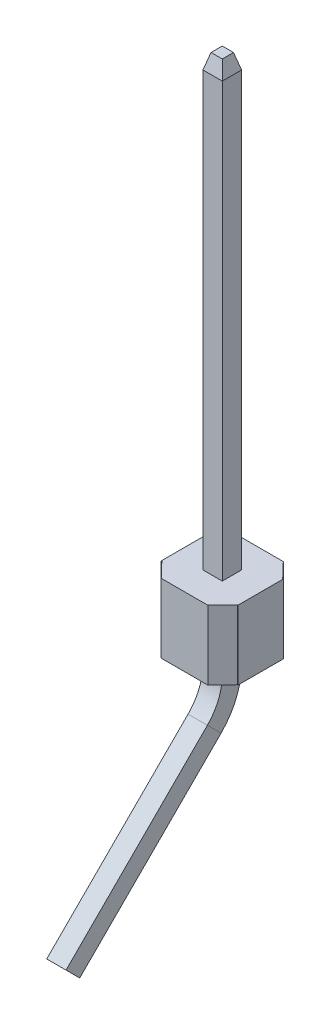
ISO-10303-21;
HEADER;
FILE_DESCRIPTION(('STEP AP214'),'2;1');
FILE_NAME('part.step','',(''),(''),'','','');
FILE_SCHEMA(('AUTOMOTIVE_DESIGN { 1 0 10303 214 1 1 1 1 }'));
ENDSEC;
DATA;
#1=APPLICATION_CONTEXT('core data for automotive mechanical design processes');
#2=APPLICATION_PROTOCOL_DEFINITION('international standard','automotive_design',2000,#1);
#3=PRODUCT_CONTEXT('',#1,'mechanical');
#4=PRODUCT('Part','Part','',(#3));
#5=PRODUCT_RELATED_PRODUCT_CATEGORY('part','',(#4));
#6=PRODUCT_DEFINITION_FORMATION('','',#4);
#7=PRODUCT_DEFINITION_CONTEXT('part definition',#1,'design');
#8=PRODUCT_DEFINITION('design','',#6,#7);
#9=PRODUCT_DEFINITION_SHAPE('','',#8);
#10=(LENGTH_UNIT() NAMED_UNIT(*) SI_UNIT(.MILLI.,.METRE.));
#11=(NAMED_UNIT(*) PLANE_ANGLE_UNIT() SI_UNIT($,.RADIAN.));
#12=(NAMED_UNIT(*) SI_UNIT($,.STERADIAN.) SOLID_ANGLE_UNIT());
#13=UNCERTAINTY_MEASURE_WITH_UNIT(LENGTH_MEASURE(1.E-05),#10,'distance_accuracy_value','');
#14=(GEOMETRIC_REPRESENTATION_CONTEXT(3) GLOBAL_UNCERTAINTY_ASSIGNED_CONTEXT((#13)) GLOBAL_UNIT_ASSIGNED_CONTEXT((#10,
#11,#12)) REPRESENTATION_CONTEXT('',''));
#15=CARTESIAN_POINT('',(0.,0.,0.));
#16=DIRECTION('',(0.,0.,1.));
#17=DIRECTION('',(1.,0.,0.));
#18=AXIS2_PLACEMENT_3D('',#15,#16,#17);
#19=CARTESIAN_POINT('',(0.,2.29,0.));
#20=DIRECTION('',(0.,-1.,0.));
#21=DIRECTION('',(0.,0.,-1.));
#22=AXIS2_PLACEMENT_3D('',#19,#20,#21);
#23=PLANE('',#22);
#24=DIRECTION('',(-0.692531828189713,0.,0.721387321030952));
#25=VECTOR('',#24,1.);
#26=CARTESIAN_POINT('',(-0.770000000000001,2.29,-1.25));
#27=LINE('',#26,#25);
#28=CARTESIAN_POINT('',(-0.770000000000001,2.29,-1.25));
#29=VERTEX_POINT('',#28);
#30=CARTESIAN_POINT('',(-1.25,2.29,-0.749999999999999));
#31=VERTEX_POINT('',#30);
#32=EDGE_CURVE('E350',#29,#31,#27,.T.);
#33=ORIENTED_EDGE('',*,*,#32,.T.);
#34=DIRECTION('',(-1.,0.,0.));
#35=VECTOR('',#34,1.);
#36=CARTESIAN_POINT('',(-1.25,2.29,-0.749999999999999));
#37=LINE('',#36,#35);
#38=CARTESIAN_POINT('',(-1.27,2.29,-0.749999999999999));
#39=VERTEX_POINT('',#38);
#40=EDGE_CURVE('E354',#31,#39,#37,.T.);
#41=ORIENTED_EDGE('',*,*,#40,.T.);
#42=DIRECTION('',(0.,0.,1.));
#43=VECTOR('',#42,1.);
#44=CARTESIAN_POINT('',(-1.27,2.29,0.75));
#45=LINE('',#44,#43);
#46=CARTESIAN_POINT('',(-1.27,2.29,0.75));
#47=VERTEX_POINT('',#46);
#48=EDGE_CURVE('E358',#39,#47,#45,.T.);
#49=ORIENTED_EDGE('',*,*,#48,.T.);
#50=DIRECTION('',(1.,0.,0.));
#51=VECTOR('',#50,1.);
#52=CARTESIAN_POINT('',(-1.25,2.29,0.75));
#53=LINE('',#52,#51);
#54=CARTESIAN_POINT('',(-1.25,2.29,0.75));
#55=VERTEX_POINT('',#54);
#56=EDGE_CURVE('E361',#47,#55,#53,.T.);
#57=ORIENTED_EDGE('',*,*,#56,.T.);
#58=DIRECTION('',(0.692531828189713,0.,0.721387321030951));
#59=VECTOR('',#58,1.);
#60=CARTESIAN_POINT('',(-0.77,2.29,1.25));
#61=LINE('',#60,#59);
#62=CARTESIAN_POINT('',(-0.77,2.29,1.25));
#63=VERTEX_POINT('',#62);
#64=EDGE_CURVE('E364',#55,#63,#61,.T.);
#65=ORIENTED_EDGE('',*,*,#64,.T.);
#66=DIRECTION('',(1.,0.,0.));
#67=VECTOR('',#66,1.);
#68=CARTESIAN_POINT('',(-0.77,2.29,1.25));
#69=LINE('',#68,#67);
#70=CARTESIAN_POINT('',(0.77,2.29,1.25));
#71=VERTEX_POINT('',#70);
#72=EDGE_CURVE('E367',#63,#71,#69,.T.);
#73=ORIENTED_EDGE('',*,*,#72,.T.);
#74=DIRECTION('',(0.692531828189713,0.,-0.721387321030952));
#75=VECTOR('',#74,1.);
#76=CARTESIAN_POINT('',(0.77,2.29,1.25));
#77=LINE('',#76,#75);
#78=CARTESIAN_POINT('',(1.25,2.29,0.749999999999999));
#79=VERTEX_POINT('',#78);
#80=EDGE_CURVE('E370',#71,#79,#77,.T.);
#81=ORIENTED_EDGE('',*,*,#80,.T.);
#82=DIRECTION('',(1.,0.,0.));
#83=VECTOR('',#82,1.);
#84=CARTESIAN_POINT('',(1.25,2.29,0.749999999999999));
#85=LINE('',#84,#83);
#86=CARTESIAN_POINT('',(1.27,2.29,0.749999999999999));
#87=VERTEX_POINT('',#86);
#88=EDGE_CURVE('E373',#79,#87,#85,.T.);
#89=ORIENTED_EDGE('',*,*,#88,.T.);
#90=DIRECTION('',(0.,0.,-1.));
#91=VECTOR('',#90,1.);
#92=CARTESIAN_POINT('',(1.27,2.29,0.749999999999999));
#93=LINE('',#92,#91);
#94=CARTESIAN_POINT('',(1.27,2.29,-0.749999999999999));
#95=VERTEX_POINT('',#94);
#96=EDGE_CURVE('E376',#87,#95,#93,.T.);
#97=ORIENTED_EDGE('',*,*,#96,.T.);
#98=DIRECTION('',(-1.,0.,0.));
#99=VECTOR('',#98,1.);
#100=CARTESIAN_POINT('',(1.25,2.29,-0.749999999999999));
#101=LINE('',#100,#99);
#102=CARTESIAN_POINT('',(1.25,2.29,-0.749999999999999));
#103=VERTEX_POINT('',#102);
#104=EDGE_CURVE('E379',#95,#103,#101,.T.);
#105=ORIENTED_EDGE('',*,*,#104,.T.);
#106=DIRECTION('',(-0.692531828189713,0.,-0.721387321030952));
#107=VECTOR('',#106,1.);
#108=CARTESIAN_POINT('',(0.77,2.29,-1.25));
#109=LINE('',#108,#107);
#110=CARTESIAN_POINT('',(0.77,2.29,-1.25));
#111=VERTEX_POINT('',#110);
#112=EDGE_CURVE('E382',#103,#111,#109,.T.);
#113=ORIENTED_EDGE('',*,*,#112,.T.);
#114=DIRECTION('',(-1.,0.,0.));
#115=VECTOR('',#114,1.);
#116=CARTESIAN_POINT('',(-0.770000000000001,2.29,-1.25));
#117=LINE('',#116,#115);
#118=EDGE_CURVE('E385',#111,#29,#117,.T.);
#119=ORIENTED_EDGE('',*,*,#118,.T.);
#120=EDGE_LOOP('',(#33,#41,#49,#57,#65,#73,#81,#89,#97,#105,#113,#119));
#121=FACE_BOUND('',#120,.T.);
#122=DIRECTION('',(0.,0.,1.));
#123=VECTOR('',#122,1.);
#124=CARTESIAN_POINT('',(-0.32,2.29,0.));
#125=LINE('',#124,#123);
#126=CARTESIAN_POINT('',(-0.32,2.29,-0.320000000000002));
#127=VERTEX_POINT('',#126);
#128=CARTESIAN_POINT('',(-0.32,2.29,0.319999999999998));
#129=VERTEX_POINT('',#128);
#130=EDGE_CURVE('E345',#127,#129,#125,.T.);
#131=ORIENTED_EDGE('',*,*,#130,.F.);
#132=DIRECTION('',(-1.,0.,0.));
#133=VECTOR('',#132,1.);
#134=CARTESIAN_POINT('',(0.,2.29,-0.320000000000002));
#135=LINE('',#134,#133);
#136=CARTESIAN_POINT('',(0.32,2.29,-0.320000000000002));
#137=VERTEX_POINT('',#136);
#138=EDGE_CURVE('E333',#137,#127,#135,.T.);
#139=ORIENTED_EDGE('',*,*,#138,.F.);
#140=DIRECTION('',(0.,0.,-1.));
#141=VECTOR('',#140,1.);
#142=CARTESIAN_POINT('',(0.32,2.29,0.));
#143=LINE('',#142,#141);
#144=CARTESIAN_POINT('',(0.32,2.29,0.32));
#145=VERTEX_POINT('',#144);
#146=EDGE_CURVE('E337',#145,#137,#143,.T.);
#147=ORIENTED_EDGE('',*,*,#146,.F.);
#148=DIRECTION('',(1.,0.,0.));
#149=VECTOR('',#148,1.);
#150=CARTESIAN_POINT('',(0.,2.29,0.319999999999998));
#151=LINE('',#150,#149);
#152=EDGE_CURVE('E341',#129,#145,#151,.T.);
#153=ORIENTED_EDGE('',*,*,#152,.F.);
#154=EDGE_LOOP('',(#131,#139,#147,#153));
#155=FACE_BOUND('',#154,.T.);
#156=ADVANCED_FACE('F43',(#121,#155),#23,.F.);
#157=CARTESIAN_POINT('',(0.,0.,0.));
#158=DIRECTION('',(0.,-1.,0.));
#159=DIRECTION('',(0.,0.,-1.));
#160=AXIS2_PLACEMENT_3D('',#157,#158,#159);
#161=PLANE('',#160);
#162=DIRECTION('',(-0.692531828189713,0.,0.721387321030952));
#163=VECTOR('',#162,1.);
#164=CARTESIAN_POINT('',(-0.770000000000001,0.,-1.25));
#165=LINE('',#164,#163);
#166=CARTESIAN_POINT('',(-0.770000000000001,0.,-1.25));
#167=VERTEX_POINT('',#166);
#168=CARTESIAN_POINT('',(-1.25,0.,-0.749999999999999));
#169=VERTEX_POINT('',#168);
#170=EDGE_CURVE('E349',#167,#169,#165,.T.);
#171=ORIENTED_EDGE('',*,*,#170,.F.);
#172=DIRECTION('',(-1.,0.,0.));
#173=VECTOR('',#172,1.);
#174=CARTESIAN_POINT('',(-0.770000000000001,0.,-1.25));
#175=LINE('',#174,#173);
#176=CARTESIAN_POINT('',(0.77,0.,-1.25));
#177=VERTEX_POINT('',#176);
#178=EDGE_CURVE('E355',#177,#167,#175,.T.);
#179=ORIENTED_EDGE('',*,*,#178,.F.);
#180=DIRECTION('',(-0.692531828189713,0.,-0.721387321030952));
#181=VECTOR('',#180,1.);
#182=CARTESIAN_POINT('',(0.77,0.,-1.25));
#183=LINE('',#182,#181);
#184=CARTESIAN_POINT('',(1.25,0.,-0.749999999999999));
#185=VERTEX_POINT('',#184);
#186=EDGE_CURVE('E419',#185,#177,#183,.T.);
#187=ORIENTED_EDGE('',*,*,#186,.F.);
#188=DIRECTION('',(-1.,0.,0.));
#189=VECTOR('',#188,1.);
#190=CARTESIAN_POINT('',(1.25,0.,-0.749999999999999));
#191=LINE('',#190,#189);
#192=CARTESIAN_POINT('',(1.27,0.,-0.749999999999999));
#193=VERTEX_POINT('',#192);
#194=EDGE_CURVE('E416',#193,#185,#191,.T.);
#195=ORIENTED_EDGE('',*,*,#194,.F.);
#196=DIRECTION('',(0.,0.,-1.));
#197=VECTOR('',#196,1.);
#198=CARTESIAN_POINT('',(1.27,0.,0.749999999999999));
#199=LINE('',#198,#197);
#200=CARTESIAN_POINT('',(1.27,0.,0.749999999999999));
#201=VERTEX_POINT('',#200);
#202=EDGE_CURVE('E413',#201,#193,#199,.T.);
#203=ORIENTED_EDGE('',*,*,#202,.F.);
#204=DIRECTION('',(1.,0.,0.));
#205=VECTOR('',#204,1.);
#206=CARTESIAN_POINT('',(1.25,0.,0.749999999999999));
#207=LINE('',#206,#205);
#208=CARTESIAN_POINT('',(1.25,0.,0.749999999999999));
#209=VERTEX_POINT('',#208);
#210=EDGE_CURVE('E410',#209,#201,#207,.T.);
#211=ORIENTED_EDGE('',*,*,#210,.F.);
#212=DIRECTION('',(0.692531828189713,0.,-0.721387321030952));
#213=VECTOR('',#212,1.);
#214=CARTESIAN_POINT('',(0.77,0.,1.25));
#215=LINE('',#214,#213);
#216=CARTESIAN_POINT('',(0.77,0.,1.25));
#217=VERTEX_POINT('',#216);
#218=EDGE_CURVE('E407',#217,#209,#215,.T.);
#219=ORIENTED_EDGE('',*,*,#218,.F.);
#220=DIRECTION('',(1.,0.,0.));
#221=VECTOR('',#220,1.);
#222=CARTESIAN_POINT('',(-0.77,0.,1.25));
#223=LINE('',#222,#221);
#224=CARTESIAN_POINT('',(-0.77,0.,1.25));
#225=VERTEX_POINT('',#224);
#226=EDGE_CURVE('E404',#225,#217,#223,.T.);
#227=ORIENTED_EDGE('',*,*,#226,.F.);
#228=DIRECTION('',(0.692531828189713,0.,0.721387321030951));
#229=VECTOR('',#228,1.);
#230=CARTESIAN_POINT('',(-0.77,0.,1.25));
#231=LINE('',#230,#229);
#232=CARTESIAN_POINT('',(-1.25,0.,0.75));
#233=VERTEX_POINT('',#232);
#234=EDGE_CURVE('E401',#233,#225,#231,.T.);
#235=ORIENTED_EDGE('',*,*,#234,.F.);
#236=DIRECTION('',(1.,0.,0.));
#237=VECTOR('',#236,1.);
#238=CARTESIAN_POINT('',(-1.25,0.,0.75));
#239=LINE('',#238,#237);
#240=CARTESIAN_POINT('',(-1.27,0.,0.75));
#241=VERTEX_POINT('',#240);
#242=EDGE_CURVE('E398',#241,#233,#239,.T.);
#243=ORIENTED_EDGE('',*,*,#242,.F.);
#244=DIRECTION('',(0.,0.,1.));
#245=VECTOR('',#244,1.);
#246=CARTESIAN_POINT('',(-1.27,0.,0.75));
#247=LINE('',#246,#245);
#248=CARTESIAN_POINT('',(-1.27,0.,-0.749999999999999));
#249=VERTEX_POINT('',#248);
#250=EDGE_CURVE('E395',#249,#241,#247,.T.);
#251=ORIENTED_EDGE('',*,*,#250,.F.);
#252=DIRECTION('',(-1.,0.,0.));
#253=VECTOR('',#252,1.);
#254=CARTESIAN_POINT('',(-1.25,0.,-0.749999999999999));
#255=LINE('',#254,#253);
#256=EDGE_CURVE('E392',#169,#249,#255,.T.);
#257=ORIENTED_EDGE('',*,*,#256,.F.);
#258=EDGE_LOOP('',(#171,#179,#187,#195,#203,#211,#219,#227,#235,#243,#251,#257));
#259=FACE_BOUND('',#258,.T.);
#260=DIRECTION('',(-1.,0.,0.));
#261=VECTOR('',#260,1.);
#262=CARTESIAN_POINT('',(0.,0.,-0.320000000000002));
#263=LINE('',#262,#261);
#264=CARTESIAN_POINT('',(0.32,0.,-0.320000000000002));
#265=VERTEX_POINT('',#264);
#266=CARTESIAN_POINT('',(-0.32,0.,-0.320000000000002));
#267=VERTEX_POINT('',#266);
#268=EDGE_CURVE('E471',#265,#267,#263,.T.);
#269=ORIENTED_EDGE('',*,*,#268,.T.);
#270=DIRECTION('',(0.,0.,1.));
#271=VECTOR('',#270,1.);
#272=CARTESIAN_POINT('',(-0.32,0.,0.));
#273=LINE('',#272,#271);
#274=CARTESIAN_POINT('',(-0.32,0.,0.319999999999998));
#275=VERTEX_POINT('',#274);
#276=EDGE_CURVE('E226',#267,#275,#273,.T.);
#277=ORIENTED_EDGE('',*,*,#276,.T.);
#278=DIRECTION('',(1.,0.,0.));
#279=VECTOR('',#278,1.);
#280=CARTESIAN_POINT('',(0.,0.,0.319999999999998));
#281=LINE('',#280,#279);
#282=CARTESIAN_POINT('',(0.32,0.,0.319999999999998));
#283=VERTEX_POINT('',#282);
#284=EDGE_CURVE('E478',#275,#283,#281,.T.);
#285=ORIENTED_EDGE('',*,*,#284,.T.);
#286=DIRECTION('',(0.,0.,-1.));
#287=VECTOR('',#286,1.);
#288=CARTESIAN_POINT('',(0.32,0.,0.));
#289=LINE('',#288,#287);
#290=EDGE_CURVE('E474',#283,#265,#289,.T.);
#291=ORIENTED_EDGE('',*,*,#290,.T.);
#292=EDGE_LOOP('',(#269,#277,#285,#291));
#293=FACE_BOUND('',#292,.T.);
#294=ADVANCED_FACE('F552',(#259,#293),#161,.T.);
#295=CARTESIAN_POINT('',(-0.770000000000001,2.29,-1.25));
#296=DIRECTION('',(0.721387321030952,0.,0.692531828189713));
#297=DIRECTION('',(0.692531828189713,0.,-0.721387321030952));
#298=AXIS2_PLACEMENT_3D('',#295,#296,#297);
#299=PLANE('',#298);
#300=ORIENTED_EDGE('',*,*,#170,.T.);
#301=DIRECTION('',(0.,-1.,0.));
#302=VECTOR('',#301,1.);
#303=CARTESIAN_POINT('',(-1.25,2.29,-0.749999999999999));
#304=LINE('',#303,#302);
#305=EDGE_CURVE('E467',#31,#169,#304,.T.);
#306=ORIENTED_EDGE('',*,*,#305,.F.);
#307=ORIENTED_EDGE('',*,*,#32,.F.);
#308=DIRECTION('',(0.,-1.,0.));
#309=VECTOR('',#308,1.);
#310=CARTESIAN_POINT('',(-0.770000000000001,2.29,-1.25));
#311=LINE('',#310,#309);
#312=EDGE_CURVE('E388',#29,#167,#311,.T.);
#313=ORIENTED_EDGE('',*,*,#312,.T.);
#314=EDGE_LOOP('',(#300,#306,#307,#313));
#315=FACE_BOUND('',#314,.T.);
#316=ADVANCED_FACE('F557',(#315),#299,.F.);
#317=CARTESIAN_POINT('',(-1.25,2.29,-0.749999999999999));
#318=DIRECTION('',(0.,0.,1.));
#319=DIRECTION('',(1.,0.,0.));
#320=AXIS2_PLACEMENT_3D('',#317,#318,#319);
#321=PLANE('',#320);
#322=ORIENTED_EDGE('',*,*,#256,.T.);
#323=DIRECTION('',(0.,-1.,0.));
#324=VECTOR('',#323,1.);
#325=CARTESIAN_POINT('',(-1.27,2.29,-0.749999999999999));
#326=LINE('',#325,#324);
#327=EDGE_CURVE('E463',#39,#249,#326,.T.);
#328=ORIENTED_EDGE('',*,*,#327,.F.);
#329=ORIENTED_EDGE('',*,*,#40,.F.);
#330=ORIENTED_EDGE('',*,*,#305,.T.);
#331=EDGE_LOOP('',(#322,#328,#329,#330));
#332=FACE_BOUND('',#331,.T.);
#333=ADVANCED_FACE('F602',(#332),#321,.F.);
#334=CARTESIAN_POINT('',(-1.27,2.29,0.75));
#335=DIRECTION('',(1.,0.,0.));
#336=DIRECTION('',(0.,0.,-1.));
#337=AXIS2_PLACEMENT_3D('',#334,#335,#336);
#338=PLANE('',#337);
#339=ORIENTED_EDGE('',*,*,#250,.T.);
#340=DIRECTION('',(0.,-1.,0.));
#341=VECTOR('',#340,1.);
#342=CARTESIAN_POINT('',(-1.27,2.29,0.75));
#343=LINE('',#342,#341);
#344=EDGE_CURVE('E459',#47,#241,#343,.T.);
#345=ORIENTED_EDGE('',*,*,#344,.F.);
#346=ORIENTED_EDGE('',*,*,#48,.F.);
#347=ORIENTED_EDGE('',*,*,#327,.T.);
#348=EDGE_LOOP('',(#339,#345,#346,#347));
#349=FACE_BOUND('',#348,.T.);
#350=ADVANCED_FACE('F598',(#349),#338,.F.);
#351=CARTESIAN_POINT('',(-1.25,2.29,0.75));
#352=DIRECTION('',(0.,0.,-1.));
#353=DIRECTION('',(-1.,0.,0.));
#354=AXIS2_PLACEMENT_3D('',#351,#352,#353);
#355=PLANE('',#354);
#356=ORIENTED_EDGE('',*,*,#242,.T.);
#357=DIRECTION('',(0.,-1.,0.));
#358=VECTOR('',#357,1.);
#359=CARTESIAN_POINT('',(-1.25,2.29,0.75));
#360=LINE('',#359,#358);
#361=EDGE_CURVE('E455',#55,#233,#360,.T.);
#362=ORIENTED_EDGE('',*,*,#361,.F.);
#363=ORIENTED_EDGE('',*,*,#56,.F.);
#364=ORIENTED_EDGE('',*,*,#344,.T.);
#365=EDGE_LOOP('',(#356,#362,#363,#364));
#366=FACE_BOUND('',#365,.T.);
#367=ADVANCED_FACE('F594',(#366),#355,.F.);
#368=CARTESIAN_POINT('',(-0.77,2.29,1.25));
#369=DIRECTION('',(0.721387321030951,0.,-0.692531828189714));
#370=DIRECTION('',(-0.692531828189714,0.,-0.721387321030951));
#371=AXIS2_PLACEMENT_3D('',#368,#369,#370);
#372=PLANE('',#371);
#373=ORIENTED_EDGE('',*,*,#234,.T.);
#374=DIRECTION('',(0.,-1.,0.));
#375=VECTOR('',#374,1.);
#376=CARTESIAN_POINT('',(-0.77,2.29,1.25));
#377=LINE('',#376,#375);
#378=EDGE_CURVE('E451',#63,#225,#377,.T.);
#379=ORIENTED_EDGE('',*,*,#378,.F.);
#380=ORIENTED_EDGE('',*,*,#64,.F.);
#381=ORIENTED_EDGE('',*,*,#361,.T.);
#382=EDGE_LOOP('',(#373,#379,#380,#381));
#383=FACE_BOUND('',#382,.T.);
#384=ADVANCED_FACE('F590',(#383),#372,.F.);
#385=CARTESIAN_POINT('',(-0.77,2.29,1.25));
#386=DIRECTION('',(0.,0.,-1.));
#387=DIRECTION('',(-1.,0.,0.));
#388=AXIS2_PLACEMENT_3D('',#385,#386,#387);
#389=PLANE('',#388);
#390=ORIENTED_EDGE('',*,*,#226,.T.);
#391=DIRECTION('',(0.,-1.,0.));
#392=VECTOR('',#391,1.);
#393=CARTESIAN_POINT('',(0.77,2.29,1.25));
#394=LINE('',#393,#392);
#395=EDGE_CURVE('E447',#71,#217,#394,.T.);
#396=ORIENTED_EDGE('',*,*,#395,.F.);
#397=ORIENTED_EDGE('',*,*,#72,.F.);
#398=ORIENTED_EDGE('',*,*,#378,.T.);
#399=EDGE_LOOP('',(#390,#396,#397,#398));
#400=FACE_BOUND('',#399,.T.);
#401=ADVANCED_FACE('F586',(#400),#389,.F.);
#402=CARTESIAN_POINT('',(0.77,2.29,1.25));
#403=DIRECTION('',(-0.721387321030952,0.,-0.692531828189713));
#404=DIRECTION('',(-0.692531828189713,0.,0.721387321030952));
#405=AXIS2_PLACEMENT_3D('',#402,#403,#404);
#406=PLANE('',#405);
#407=ORIENTED_EDGE('',*,*,#218,.T.);
#408=DIRECTION('',(0.,-1.,0.));
#409=VECTOR('',#408,1.);
#410=CARTESIAN_POINT('',(1.25,2.29,0.749999999999999));
#411=LINE('',#410,#409);
#412=EDGE_CURVE('E443',#79,#209,#411,.T.);
#413=ORIENTED_EDGE('',*,*,#412,.F.);
#414=ORIENTED_EDGE('',*,*,#80,.F.);
#415=ORIENTED_EDGE('',*,*,#395,.T.);
#416=EDGE_LOOP('',(#407,#413,#414,#415));
#417=FACE_BOUND('',#416,.T.);
#418=ADVANCED_FACE('F582',(#417),#406,.F.);
#419=CARTESIAN_POINT('',(1.25,2.29,0.749999999999999));
#420=DIRECTION('',(0.,0.,-1.));
#421=DIRECTION('',(-1.,0.,0.));
#422=AXIS2_PLACEMENT_3D('',#419,#420,#421);
#423=PLANE('',#422);
#424=ORIENTED_EDGE('',*,*,#210,.T.);
#425=DIRECTION('',(0.,-1.,0.));
#426=VECTOR('',#425,1.);
#427=CARTESIAN_POINT('',(1.27,2.29,0.749999999999999));
#428=LINE('',#427,#426);
#429=EDGE_CURVE('E439',#87,#201,#428,.T.);
#430=ORIENTED_EDGE('',*,*,#429,.F.);
#431=ORIENTED_EDGE('',*,*,#88,.F.);
#432=ORIENTED_EDGE('',*,*,#412,.T.);
#433=EDGE_LOOP('',(#424,#430,#431,#432));
#434=FACE_BOUND('',#433,.T.);
#435=ADVANCED_FACE('F578',(#434),#423,.F.);
#436=CARTESIAN_POINT('',(1.27,2.29,0.749999999999999));
#437=DIRECTION('',(-1.,0.,0.));
#438=DIRECTION('',(0.,0.,1.));
#439=AXIS2_PLACEMENT_3D('',#436,#437,#438);
#440=PLANE('',#439);
#441=ORIENTED_EDGE('',*,*,#202,.T.);
#442=DIRECTION('',(0.,-1.,0.));
#443=VECTOR('',#442,1.);
#444=CARTESIAN_POINT('',(1.27,2.29,-0.749999999999999));
#445=LINE('',#444,#443);
#446=EDGE_CURVE('E435',#95,#193,#445,.T.);
#447=ORIENTED_EDGE('',*,*,#446,.F.);
#448=ORIENTED_EDGE('',*,*,#96,.F.);
#449=ORIENTED_EDGE('',*,*,#429,.T.);
#450=EDGE_LOOP('',(#441,#447,#448,#449));
#451=FACE_BOUND('',#450,.T.);
#452=ADVANCED_FACE('F574',(#451),#440,.F.);
#453=CARTESIAN_POINT('',(1.25,2.29,-0.749999999999999));
#454=DIRECTION('',(0.,0.,1.));
#455=DIRECTION('',(1.,0.,0.));
#456=AXIS2_PLACEMENT_3D('',#453,#454,#455);
#457=PLANE('',#456);
#458=ORIENTED_EDGE('',*,*,#194,.T.);
#459=DIRECTION('',(0.,-1.,0.));
#460=VECTOR('',#459,1.);
#461=CARTESIAN_POINT('',(1.25,2.29,-0.749999999999999));
#462=LINE('',#461,#460);
#463=EDGE_CURVE('E431',#103,#185,#462,.T.);
#464=ORIENTED_EDGE('',*,*,#463,.F.);
#465=ORIENTED_EDGE('',*,*,#104,.F.);
#466=ORIENTED_EDGE('',*,*,#446,.T.);
#467=EDGE_LOOP('',(#458,#464,#465,#466));
#468=FACE_BOUND('',#467,.T.);
#469=ADVANCED_FACE('F570',(#468),#457,.F.);
#470=CARTESIAN_POINT('',(0.77,2.29,-1.25));
#471=DIRECTION('',(-0.721387321030952,0.,0.692531828189713));
#472=DIRECTION('',(0.692531828189713,0.,0.721387321030952));
#473=AXIS2_PLACEMENT_3D('',#470,#471,#472);
#474=PLANE('',#473);
#475=ORIENTED_EDGE('',*,*,#186,.T.);
#476=DIRECTION('',(0.,-1.,0.));
#477=VECTOR('',#476,1.);
#478=CARTESIAN_POINT('',(0.77,2.29,-1.25));
#479=LINE('',#478,#477);
#480=EDGE_CURVE('E427',#111,#177,#479,.T.);
#481=ORIENTED_EDGE('',*,*,#480,.F.);
#482=ORIENTED_EDGE('',*,*,#112,.F.);
#483=ORIENTED_EDGE('',*,*,#463,.T.);
#484=EDGE_LOOP('',(#475,#481,#482,#483));
#485=FACE_BOUND('',#484,.T.);
#486=ADVANCED_FACE('F566',(#485),#474,.F.);
#487=CARTESIAN_POINT('',(-0.770000000000001,2.29,-1.25));
#488=DIRECTION('',(0.,0.,1.));
#489=DIRECTION('',(1.,0.,0.));
#490=AXIS2_PLACEMENT_3D('',#487,#488,#489);
#491=PLANE('',#490);
#492=ORIENTED_EDGE('',*,*,#178,.T.);
#493=ORIENTED_EDGE('',*,*,#312,.F.);
#494=ORIENTED_EDGE('',*,*,#118,.F.);
#495=ORIENTED_EDGE('',*,*,#480,.T.);
#496=EDGE_LOOP('',(#492,#493,#494,#495));
#497=FACE_BOUND('',#496,.T.);
#498=ADVANCED_FACE('F562',(#497),#491,.F.);
#499=CARTESIAN_POINT('',(-0.32,-2.0486299675656,0.359512267647215));
#500=DIRECTION('',(0.,0.707106781186549,0.707106781186547));
#501=DIRECTION('',(0.,-0.707106781186547,0.707106781186549));
#502=AXIS2_PLACEMENT_3D('',#499,#500,#501);
#503=PLANE('',#502);
#504=DIRECTION('',(-1.,0.,0.));
#505=VECTOR('',#504,1.);
#506=CARTESIAN_POINT('',(-0.32,-6.72627416997969,5.03715647006133));
#507=LINE('',#506,#505);
#508=CARTESIAN_POINT('',(0.32,-6.72627416997969,5.03715647006132));
#509=VERTEX_POINT('',#508);
#510=CARTESIAN_POINT('',(-0.32,-6.72627416997969,5.03715647006132));
#511=VERTEX_POINT('',#510);
#512=EDGE_CURVE('E327',#509,#511,#507,.T.);
#513=ORIENTED_EDGE('',*,*,#512,.T.);
#514=DIRECTION('',(0.,-0.707106781186546,0.707106781186548));
#515=VECTOR('',#514,1.);
#516=CARTESIAN_POINT('',(-0.32,-2.0486299675656,0.359512267647215));
#517=LINE('',#516,#515);
#518=CARTESIAN_POINT('',(-0.32,-2.04862996756565,0.359512267647168));
#519=VERTEX_POINT('',#518);
#520=EDGE_CURVE('E281',#519,#511,#517,.T.);
#521=ORIENTED_EDGE('',*,*,#520,.F.);
#522=DIRECTION('',(-1.,0.,0.));
#523=VECTOR('',#522,1.);
#524=CARTESIAN_POINT('',(-0.32,-2.0486299675656,0.359512267647216));
#525=LINE('',#524,#523);
#526=CARTESIAN_POINT('',(0.32,-2.04862996756565,0.359512267647168));
#527=VERTEX_POINT('',#526);
#528=EDGE_CURVE('E243',#527,#519,#525,.T.);
#529=ORIENTED_EDGE('',*,*,#528,.F.);
#530=DIRECTION('',(0.,-0.707106781186546,0.707106781186548));
#531=VECTOR('',#530,1.);
#532=CARTESIAN_POINT('',(0.32,-2.0486299675656,0.359512267647215));
#533=LINE('',#532,#531);
#534=EDGE_CURVE('E324',#527,#509,#533,.T.);
#535=ORIENTED_EDGE('',*,*,#534,.T.);
#536=EDGE_LOOP('',(#513,#521,#529,#535));
#537=FACE_BOUND('',#536,.T.);
#538=ADVANCED_FACE('F565',(#537),#503,.F.);
#539=CARTESIAN_POINT('',(0.32,-2.0486299675656,0.359512267647215));
#540=DIRECTION('',(-1.,0.,0.));
#541=DIRECTION('',(0.,-1.,0.));
#542=AXIS2_PLACEMENT_3D('',#539,#540,#541);
#543=PLANE('',#542);
#544=ORIENTED_EDGE('',*,*,#534,.F.);
#545=DIRECTION('',(0.,-0.707106781186551,-0.707106781186544));
#546=VECTOR('',#545,1.);
#547=CARTESIAN_POINT('',(0.32,-2.0486299675656,0.359512267647216));
#548=LINE('',#547,#546);
#549=CARTESIAN_POINT('',(0.32,-1.59608162760626,0.812060607606556));
#550=VERTEX_POINT('',#549);
#551=EDGE_CURVE('E304',#550,#527,#548,.T.);
#552=ORIENTED_EDGE('',*,*,#551,.F.);
#553=DIRECTION('',(0.,-0.707106781186546,0.707106781186548));
#554=VECTOR('',#553,1.);
#555=CARTESIAN_POINT('',(0.32,-1.59608162760621,0.812060607606605));
#556=LINE('',#555,#554);
#557=CARTESIAN_POINT('',(0.32,-6.2737258300203,5.48970481002072));
#558=VERTEX_POINT('',#557);
#559=EDGE_CURVE('E307',#550,#558,#556,.T.);
#560=ORIENTED_EDGE('',*,*,#559,.T.);
#561=DIRECTION('',(0.,-0.707106781186549,-0.707106781186546));
#562=VECTOR('',#561,1.);
#563=CARTESIAN_POINT('',(0.32,-6.72627416997969,5.03715647006133));
#564=LINE('',#563,#562);
#565=EDGE_CURVE('E311',#558,#509,#564,.T.);
#566=ORIENTED_EDGE('',*,*,#565,.T.);
#567=EDGE_LOOP('',(#544,#552,#560,#566));
#568=FACE_BOUND('',#567,.T.);
#569=ADVANCED_FACE('F762',(#568),#543,.F.);
#570=CARTESIAN_POINT('',(-0.32,-1.59608162760621,0.812060607606605));
#571=DIRECTION('',(0.,-0.707106781186549,-0.707106781186547));
#572=DIRECTION('',(0.,0.707106781186547,-0.707106781186549));
#573=AXIS2_PLACEMENT_3D('',#570,#571,#572);
#574=PLANE('',#573);
#575=ORIENTED_EDGE('',*,*,#559,.F.);
#576=DIRECTION('',(1.,0.,0.));
#577=VECTOR('',#576,1.);
#578=CARTESIAN_POINT('',(-0.32,-1.59608162760621,0.812060607606604));
#579=LINE('',#578,#577);
#580=CARTESIAN_POINT('',(-0.32,-1.59608162760626,0.812060607606556));
#581=VERTEX_POINT('',#580);
#582=EDGE_CURVE('E275',#581,#550,#579,.T.);
#583=ORIENTED_EDGE('',*,*,#582,.F.);
#584=DIRECTION('',(0.,-0.707106781186546,0.707106781186548));
#585=VECTOR('',#584,1.);
#586=CARTESIAN_POINT('',(-0.32,-1.59608162760621,0.812060607606605));
#587=LINE('',#586,#585);
#588=CARTESIAN_POINT('',(-0.32,-6.2737258300203,5.48970481002072));
#589=VERTEX_POINT('',#588);
#590=EDGE_CURVE('E280',#581,#589,#587,.T.);
#591=ORIENTED_EDGE('',*,*,#590,.T.);
#592=DIRECTION('',(1.,0.,0.));
#593=VECTOR('',#592,1.);
#594=CARTESIAN_POINT('',(-0.32,-6.2737258300203,5.48970481002072));
#595=LINE('',#594,#593);
#596=EDGE_CURVE('E285',#589,#558,#595,.T.);
#597=ORIENTED_EDGE('',*,*,#596,.T.);
#598=EDGE_LOOP('',(#575,#583,#591,#597));
#599=FACE_BOUND('',#598,.T.);
#600=ADVANCED_FACE('F753',(#599),#574,.F.);
#601=CARTESIAN_POINT('',(-0.32,-2.0486299675656,0.359512267647215));
#602=DIRECTION('',(1.,0.,0.));
#603=DIRECTION('',(0.,1.,0.));
#604=AXIS2_PLACEMENT_3D('',#601,#602,#603);
#605=PLANE('',#604);
#606=ORIENTED_EDGE('',*,*,#590,.F.);
#607=DIRECTION('',(0.,0.707106781186551,0.707106781186544));
#608=VECTOR('',#607,1.);
#609=CARTESIAN_POINT('',(-0.32,-2.0486299675656,0.359512267647216));
#610=LINE('',#609,#608);
#611=EDGE_CURVE('E248',#519,#581,#610,.T.);
#612=ORIENTED_EDGE('',*,*,#611,.F.);
#613=ORIENTED_EDGE('',*,*,#520,.T.);
#614=DIRECTION('',(0.,0.707106781186549,0.707106781186546));
#615=VECTOR('',#614,1.);
#616=CARTESIAN_POINT('',(-0.32,-6.72627416997969,5.03715647006133));
#617=LINE('',#616,#615);
#618=EDGE_CURVE('E277',#511,#589,#617,.T.);
#619=ORIENTED_EDGE('',*,*,#618,.T.);
#620=EDGE_LOOP('',(#606,#612,#613,#619));
#621=FACE_BOUND('',#620,.T.);
#622=ADVANCED_FACE('F745',(#621),#605,.F.);
#623=CARTESIAN_POINT('',(0.,-0.4081422352128,2.));
#624=DIRECTION('',(-1.,0.,0.));
#625=DIRECTION('',(0.,0.,1.));
#626=AXIS2_PLACEMENT_3D('',#623,#624,#625);
#627=CYLINDRICAL_SURFACE('',#626,2.32000000000007);
#628=ORIENTED_EDGE('',*,*,#528,.T.);
#629=CARTESIAN_POINT('',(-0.32,-0.4081422352128,2.));
#630=DIRECTION('',(-1.,0.,0.));
#631=DIRECTION('',(0.,0.,-1.));
#632=AXIS2_PLACEMENT_3D('',#629,#630,#631);
#633=CIRCLE('',#632,2.32000000000007);
#634=CARTESIAN_POINT('',(-0.32,-0.408142235212777,-0.320000000000002));
#635=VERTEX_POINT('',#634);
#636=EDGE_CURVE('E237',#635,#519,#633,.T.);
#637=ORIENTED_EDGE('',*,*,#636,.F.);
#638=DIRECTION('',(-1.,0.,0.));
#639=VECTOR('',#638,1.);
#640=CARTESIAN_POINT('',(-0.32,-0.408142235212783,-0.320000000000002));
#641=LINE('',#640,#639);
#642=CARTESIAN_POINT('',(0.32,-0.408142235212777,-0.320000000000002));
#643=VERTEX_POINT('',#642);
#644=EDGE_CURVE('E240',#643,#635,#641,.T.);
#645=ORIENTED_EDGE('',*,*,#644,.F.);
#646=CARTESIAN_POINT('',(0.32,-0.4081422352128,2.));
#647=DIRECTION('',(-1.,0.,0.));
#648=DIRECTION('',(0.,0.,-1.));
#649=AXIS2_PLACEMENT_3D('',#646,#647,#648);
#650=CIRCLE('',#649,2.32000000000007);
#651=EDGE_CURVE('E319',#643,#527,#650,.T.);
#652=ORIENTED_EDGE('',*,*,#651,.T.);
#653=EDGE_LOOP('',(#628,#637,#645,#652));
#654=FACE_BOUND('',#653,.T.);
#655=ADVANCED_FACE('F238',(#654),#627,.T.);
#656=CARTESIAN_POINT('',(0.32,-0.40814223521279,-0.320000000000071));
#657=DIRECTION('',(-1.,0.,0.));
#658=DIRECTION('',(0.,0.,1.));
#659=AXIS2_PLACEMENT_3D('',#656,#657,#658);
#660=PLANE('',#659);
#661=ORIENTED_EDGE('',*,*,#651,.F.);
#662=DIRECTION('',(0.,0.,-1.));
#663=VECTOR('',#662,1.);
#664=CARTESIAN_POINT('',(0.32,-0.408142235212783,-0.320000000000002));
#665=LINE('',#664,#663);
#666=CARTESIAN_POINT('',(0.32,-0.408142235212777,0.319999999999998));
#667=VERTEX_POINT('',#666);
#668=EDGE_CURVE('E296',#667,#643,#665,.T.);
#669=ORIENTED_EDGE('',*,*,#668,.F.);
#670=CARTESIAN_POINT('',(0.32,-0.4081422352128,2.));
#671=DIRECTION('',(-1.,0.,0.));
#672=DIRECTION('',(0.,0.,-1.));
#673=AXIS2_PLACEMENT_3D('',#670,#671,#672);
#674=CIRCLE('',#673,1.68000000000007);
#675=EDGE_CURVE('E300',#667,#550,#674,.T.);
#676=ORIENTED_EDGE('',*,*,#675,.T.);
#677=ORIENTED_EDGE('',*,*,#551,.T.);
#678=EDGE_LOOP('',(#661,#669,#676,#677));
#679=FACE_BOUND('',#678,.T.);
#680=ADVANCED_FACE('F728',(#679),#660,.F.);
#681=CARTESIAN_POINT('',(0.,-0.4081422352128,2.));
#682=DIRECTION('',(-1.,0.,0.));
#683=DIRECTION('',(0.,0.,1.));
#684=AXIS2_PLACEMENT_3D('',#681,#682,#683);
#685=CYLINDRICAL_SURFACE('',#684,1.68000000000007);
#686=ORIENTED_EDGE('',*,*,#675,.F.);
#687=DIRECTION('',(1.,0.,0.));
#688=VECTOR('',#687,1.);
#689=CARTESIAN_POINT('',(-0.32,-0.408142235212783,0.319999999999998));
#690=LINE('',#689,#688);
#691=CARTESIAN_POINT('',(-0.32,-0.408142235212777,0.319999999999998));
#692=VERTEX_POINT('',#691);
#693=EDGE_CURVE('E270',#692,#667,#690,.T.);
#694=ORIENTED_EDGE('',*,*,#693,.F.);
#695=CARTESIAN_POINT('',(-0.32,-0.4081422352128,2.));
#696=DIRECTION('',(-1.,0.,0.));
#697=DIRECTION('',(0.,0.,-1.));
#698=AXIS2_PLACEMENT_3D('',#695,#696,#697);
#699=CIRCLE('',#698,1.68000000000007);
#700=EDGE_CURVE('E260',#692,#581,#699,.T.);
#701=ORIENTED_EDGE('',*,*,#700,.T.);
#702=ORIENTED_EDGE('',*,*,#582,.T.);
#703=EDGE_LOOP('',(#686,#694,#701,#702));
#704=FACE_BOUND('',#703,.T.);
#705=ADVANCED_FACE('F720',(#704),#685,.F.);
#706=CARTESIAN_POINT('',(-0.32,-0.40814223521279,-0.320000000000071));
#707=DIRECTION('',(1.,0.,0.));
#708=DIRECTION('',(0.,0.,-1.));
#709=AXIS2_PLACEMENT_3D('',#706,#707,#708);
#710=PLANE('',#709);
#711=ORIENTED_EDGE('',*,*,#700,.F.);
#712=DIRECTION('',(0.,0.,1.));
#713=VECTOR('',#712,1.);
#714=CARTESIAN_POINT('',(-0.32,-0.408142235212783,-0.320000000000002));
#715=LINE('',#714,#713);
#716=EDGE_CURVE('E224',#635,#692,#715,.T.);
#717=ORIENTED_EDGE('',*,*,#716,.F.);
#718=ORIENTED_EDGE('',*,*,#636,.T.);
#719=ORIENTED_EDGE('',*,*,#611,.T.);
#720=EDGE_LOOP('',(#711,#717,#718,#719));
#721=FACE_BOUND('',#720,.T.);
#722=ADVANCED_FACE('F258',(#721),#710,.F.);
#723=CARTESIAN_POINT('',(-0.32,17.12,-0.32));
#724=DIRECTION('',(0.,0.,1.));
#725=DIRECTION('',(0.,-1.,0.));
#726=AXIS2_PLACEMENT_3D('',#723,#724,#725);
#727=PLANE('',#726);
#728=ORIENTED_EDGE('',*,*,#268,.F.);
#729=DIRECTION('',(0.,-1.,0.));
#730=VECTOR('',#729,1.);
#731=CARTESIAN_POINT('',(0.32,17.12,-0.32));
#732=LINE('',#731,#730);
#733=EDGE_CURVE('E252',#265,#643,#732,.T.);
#734=ORIENTED_EDGE('',*,*,#733,.T.);
#735=ORIENTED_EDGE('',*,*,#644,.T.);
#736=DIRECTION('',(0.,-1.,0.));
#737=VECTOR('',#736,1.);
#738=CARTESIAN_POINT('',(-0.32,17.12,-0.32));
#739=LINE('',#738,#737);
#740=EDGE_CURVE('E219',#267,#635,#739,.T.);
#741=ORIENTED_EDGE('',*,*,#740,.F.);
#742=EDGE_LOOP('',(#728,#734,#735,#741));
#743=FACE_BOUND('',#742,.T.);
#744=ADVANCED_FACE('F250',(#743),#727,.F.);
#745=CARTESIAN_POINT('',(0.32,17.12,-0.32));
#746=DIRECTION('',(-1.,0.,0.));
#747=DIRECTION('',(0.,0.,1.));
#748=AXIS2_PLACEMENT_3D('',#745,#746,#747);
#749=PLANE('',#748);
#750=ORIENTED_EDGE('',*,*,#290,.F.);
#751=DIRECTION('',(0.,-1.,0.));
#752=VECTOR('',#751,1.);
#753=CARTESIAN_POINT('',(0.32,17.12,0.32));
#754=LINE('',#753,#752);
#755=EDGE_CURVE('E292',#283,#667,#754,.T.);
#756=ORIENTED_EDGE('',*,*,#755,.T.);
#757=ORIENTED_EDGE('',*,*,#668,.T.);
#758=ORIENTED_EDGE('',*,*,#733,.F.);
#759=EDGE_LOOP('',(#750,#756,#757,#758));
#760=FACE_BOUND('',#759,.T.);
#761=ADVANCED_FACE('F663',(#760),#749,.F.);
#762=CARTESIAN_POINT('',(-0.32,17.12,0.32));
#763=DIRECTION('',(0.,0.,-1.));
#764=DIRECTION('',(0.,1.,0.));
#765=AXIS2_PLACEMENT_3D('',#762,#763,#764);
#766=PLANE('',#765);
#767=ORIENTED_EDGE('',*,*,#284,.F.);
#768=DIRECTION('',(0.,-1.,0.));
#769=VECTOR('',#768,1.);
#770=CARTESIAN_POINT('',(-0.32,17.12,0.32));
#771=LINE('',#770,#769);
#772=EDGE_CURVE('E263',#275,#692,#771,.T.);
#773=ORIENTED_EDGE('',*,*,#772,.T.);
#774=ORIENTED_EDGE('',*,*,#693,.T.);
#775=ORIENTED_EDGE('',*,*,#755,.F.);
#776=EDGE_LOOP('',(#767,#773,#774,#775));
#777=FACE_BOUND('',#776,.T.);
#778=ADVANCED_FACE('F672',(#777),#766,.F.);
#779=CARTESIAN_POINT('',(-0.32,17.12,-0.32));
#780=DIRECTION('',(1.,0.,0.));
#781=DIRECTION('',(0.,0.,-1.));
#782=AXIS2_PLACEMENT_3D('',#779,#780,#781);
#783=PLANE('',#782);
#784=ORIENTED_EDGE('',*,*,#276,.F.);
#785=ORIENTED_EDGE('',*,*,#740,.T.);
#786=ORIENTED_EDGE('',*,*,#716,.T.);
#787=ORIENTED_EDGE('',*,*,#772,.F.);
#788=EDGE_LOOP('',(#784,#785,#786,#787));
#789=FACE_BOUND('',#788,.T.);
#790=ADVANCED_FACE('F221',(#789),#783,.F.);
#791=CARTESIAN_POINT('',(0.,-6.5,5.26343064004102));
#792=DIRECTION('',(0.,0.707106781186546,-0.707106781186549));
#793=DIRECTION('',(0.,0.707106781186549,0.707106781186546));
#794=AXIS2_PLACEMENT_3D('',#791,#792,#793);
#795=PLANE('',#794);
#796=ORIENTED_EDGE('',*,*,#565,.F.);
#797=ORIENTED_EDGE('',*,*,#596,.F.);
#798=ORIENTED_EDGE('',*,*,#618,.F.);
#799=ORIENTED_EDGE('',*,*,#512,.F.);
#800=EDGE_LOOP('',(#796,#797,#798,#799));
#801=FACE_BOUND('',#800,.T.);
#802=ADVANCED_FACE('F679',(#801),#795,.F.);
#803=CARTESIAN_POINT('',(-0.32,16.62,0.32));
#804=VERTEX_POINT('',#803);
#805=EDGE_CURVE('E267',#804,#129,#771,.T.);
#806=ORIENTED_EDGE('',*,*,#805,.F.);
#807=DIRECTION('',(0.,0.,-1.));
#808=VECTOR('',#807,1.);
#809=CARTESIAN_POINT('',(-0.32,16.62,-0.32));
#810=LINE('',#809,#808);
#811=CARTESIAN_POINT('',(-0.32,16.62,-0.32));
#812=VERTEX_POINT('',#811);
#813=EDGE_CURVE('E69',#804,#812,#810,.T.);
#814=ORIENTED_EDGE('',*,*,#813,.T.);
#815=EDGE_CURVE('E231',#812,#127,#739,.T.);
#816=ORIENTED_EDGE('',*,*,#815,.T.);
#817=ORIENTED_EDGE('',*,*,#130,.T.);
#818=EDGE_LOOP('',(#806,#814,#816,#817));
#819=FACE_BOUND('',#818,.T.);
#820=ADVANCED_FACE('F670',(#819),#783,.F.);
#821=CARTESIAN_POINT('',(0.32,16.62,0.32));
#822=VERTEX_POINT('',#821);
#823=EDGE_CURVE('E293',#822,#145,#754,.T.);
#824=ORIENTED_EDGE('',*,*,#823,.F.);
#825=DIRECTION('',(-1.,0.,0.));
#826=VECTOR('',#825,1.);
#827=CARTESIAN_POINT('',(-0.32,16.62,0.32));
#828=LINE('',#827,#826);
#829=EDGE_CURVE('E497',#822,#804,#828,.T.);
#830=ORIENTED_EDGE('',*,*,#829,.T.);
#831=ORIENTED_EDGE('',*,*,#805,.T.);
#832=ORIENTED_EDGE('',*,*,#152,.T.);
#833=EDGE_LOOP('',(#824,#830,#831,#832));
#834=FACE_BOUND('',#833,.T.);
#835=ADVANCED_FACE('F534',(#834),#766,.F.);
#836=CARTESIAN_POINT('',(0.32,16.62,-0.32));
#837=VERTEX_POINT('',#836);
#838=EDGE_CURVE('E255',#837,#137,#732,.T.);
#839=ORIENTED_EDGE('',*,*,#838,.F.);
#840=DIRECTION('',(0.,0.,1.));
#841=VECTOR('',#840,1.);
#842=CARTESIAN_POINT('',(0.32,16.62,0.32));
#843=LINE('',#842,#841);
#844=EDGE_CURVE('E11',#837,#822,#843,.T.);
#845=ORIENTED_EDGE('',*,*,#844,.T.);
#846=ORIENTED_EDGE('',*,*,#823,.T.);
#847=ORIENTED_EDGE('',*,*,#146,.T.);
#848=EDGE_LOOP('',(#839,#845,#846,#847));
#849=FACE_BOUND('',#848,.T.);
#850=ADVANCED_FACE('F530',(#849),#749,.F.);
#851=ORIENTED_EDGE('',*,*,#815,.F.);
#852=DIRECTION('',(1.,0.,0.));
#853=VECTOR('',#852,1.);
#854=CARTESIAN_POINT('',(0.32,16.62,-0.32));
#855=LINE('',#854,#853);
#856=EDGE_CURVE('E54',#812,#837,#855,.T.);
#857=ORIENTED_EDGE('',*,*,#856,.T.);
#858=ORIENTED_EDGE('',*,*,#838,.T.);
#859=ORIENTED_EDGE('',*,*,#138,.T.);
#860=EDGE_LOOP('',(#851,#857,#858,#859));
#861=FACE_BOUND('',#860,.T.);
#862=ADVANCED_FACE('F542',(#861),#727,.F.);
#863=CARTESIAN_POINT('',(0.,17.12,0.));
#864=DIRECTION('',(0.,1.,0.));
#865=DIRECTION('',(0.,0.,1.));
#866=AXIS2_PLACEMENT_3D('',#863,#864,#865);
#867=PLANE('',#866);
#868=DIRECTION('',(0.,0.,1.));
#869=VECTOR('',#868,1.);
#870=CARTESIAN_POINT('',(-0.186025403784438,17.12,0.32));
#871=LINE('',#870,#869);
#872=CARTESIAN_POINT('',(-0.186025403784438,17.12,-0.186025403784438));
#873=VERTEX_POINT('',#872);
#874=CARTESIAN_POINT('',(-0.186025403784438,17.12,0.186025403784438));
#875=VERTEX_POINT('',#874);
#876=EDGE_CURVE('E490',#873,#875,#871,.T.);
#877=ORIENTED_EDGE('',*,*,#876,.T.);
#878=DIRECTION('',(1.,0.,0.));
#879=VECTOR('',#878,1.);
#880=CARTESIAN_POINT('',(0.32,17.12,0.186025403784438));
#881=LINE('',#880,#879);
#882=CARTESIAN_POINT('',(0.186025403784438,17.12,0.186025403784438));
#883=VERTEX_POINT('',#882);
#884=EDGE_CURVE('E493',#875,#883,#881,.T.);
#885=ORIENTED_EDGE('',*,*,#884,.T.);
#886=DIRECTION('',(0.,0.,-1.));
#887=VECTOR('',#886,1.);
#888=CARTESIAN_POINT('',(0.186025403784438,17.12,-0.32));
#889=LINE('',#888,#887);
#890=CARTESIAN_POINT('',(0.186025403784438,17.12,-0.186025403784438));
#891=VERTEX_POINT('',#890);
#892=EDGE_CURVE('E484',#883,#891,#889,.T.);
#893=ORIENTED_EDGE('',*,*,#892,.T.);
#894=DIRECTION('',(-1.,0.,0.));
#895=VECTOR('',#894,1.);
#896=CARTESIAN_POINT('',(-0.32,17.12,-0.186025403784438));
#897=LINE('',#896,#895);
#898=EDGE_CURVE('E487',#891,#873,#897,.T.);
#899=ORIENTED_EDGE('',*,*,#898,.T.);
#900=EDGE_LOOP('',(#877,#885,#893,#899));
#901=FACE_BOUND('',#900,.T.);
#902=ADVANCED_FACE('F540',(#901),#867,.T.);
#903=CARTESIAN_POINT('',(0.,17.12,-0.186025403784438));
#904=DIRECTION('',(0.,0.258819045102519,-0.965925826289069));
#905=DIRECTION('',(1.,0.,0.));
#906=AXIS2_PLACEMENT_3D('',#903,#904,#905);
#907=PLANE('',#906);
#908=DIRECTION('',(-0.25056280708573,0.93511312653103,0.25056280708573));
#909=VECTOR('',#908,1.);
#910=CARTESIAN_POINT('',(0.174346408916338,17.1635866022291,-0.174346408916338));
#911=LINE('',#910,#909);
#912=EDGE_CURVE('E510',#837,#891,#911,.T.);
#913=ORIENTED_EDGE('',*,*,#912,.F.);
#914=ORIENTED_EDGE('',*,*,#856,.F.);
#915=DIRECTION('',(0.25056280708573,0.93511312653103,0.25056280708573));
#916=VECTOR('',#915,1.);
#917=CARTESIAN_POINT('',(-0.174346408916338,17.1635866022291,-0.174346408916338));
#918=LINE('',#917,#916);
#919=EDGE_CURVE('E48',#873,#812,#918,.F.);
#920=ORIENTED_EDGE('',*,*,#919,.F.);
#921=ORIENTED_EDGE('',*,*,#898,.F.);
#922=EDGE_LOOP('',(#913,#914,#920,#921));
#923=FACE_BOUND('',#922,.T.);
#924=ADVANCED_FACE('F46',(#923),#907,.T.);
#925=CARTESIAN_POINT('',(-0.186025403784438,17.12,0.));
#926=DIRECTION('',(-0.965925826289069,0.258819045102519,0.));
#927=DIRECTION('',(0.,0.,-1.));
#928=AXIS2_PLACEMENT_3D('',#925,#926,#927);
#929=PLANE('',#928);
#930=ORIENTED_EDGE('',*,*,#919,.T.);
#931=ORIENTED_EDGE('',*,*,#813,.F.);
#932=DIRECTION('',(0.25056280708573,0.93511312653103,-0.25056280708573));
#933=VECTOR('',#932,1.);
#934=CARTESIAN_POINT('',(-0.174346408916338,17.1635866022291,0.174346408916338));
#935=LINE('',#934,#933);
#936=EDGE_CURVE('E508',#875,#804,#935,.F.);
#937=ORIENTED_EDGE('',*,*,#936,.F.);
#938=ORIENTED_EDGE('',*,*,#876,.F.);
#939=EDGE_LOOP('',(#930,#931,#937,#938));
#940=FACE_BOUND('',#939,.T.);
#941=ADVANCED_FACE('F522',(#940),#929,.T.);
#942=CARTESIAN_POINT('',(0.186025403784438,17.12,0.));
#943=DIRECTION('',(0.965925826289069,0.258819045102519,0.));
#944=DIRECTION('',(0.,0.,1.));
#945=AXIS2_PLACEMENT_3D('',#942,#943,#944);
#946=PLANE('',#945);
#947=ORIENTED_EDGE('',*,*,#912,.T.);
#948=ORIENTED_EDGE('',*,*,#892,.F.);
#949=DIRECTION('',(0.25056280708573,-0.93511312653103,0.25056280708573));
#950=VECTOR('',#949,1.);
#951=CARTESIAN_POINT('',(0.174346408916338,17.1635866022291,0.174346408916338));
#952=LINE('',#951,#950);
#953=EDGE_CURVE('E505',#822,#883,#952,.F.);
#954=ORIENTED_EDGE('',*,*,#953,.F.);
#955=ORIENTED_EDGE('',*,*,#844,.F.);
#956=EDGE_LOOP('',(#947,#948,#954,#955));
#957=FACE_BOUND('',#956,.T.);
#958=ADVANCED_FACE('F527',(#957),#946,.T.);
#959=CARTESIAN_POINT('',(0.,17.12,0.186025403784438));
#960=DIRECTION('',(0.,0.258819045102519,0.965925826289069));
#961=DIRECTION('',(-1.,0.,0.));
#962=AXIS2_PLACEMENT_3D('',#959,#960,#961);
#963=PLANE('',#962);
#964=ORIENTED_EDGE('',*,*,#936,.T.);
#965=ORIENTED_EDGE('',*,*,#829,.F.);
#966=ORIENTED_EDGE('',*,*,#953,.T.);
#967=ORIENTED_EDGE('',*,*,#884,.F.);
#968=EDGE_LOOP('',(#964,#965,#966,#967));
#969=FACE_BOUND('',#968,.T.);
#970=ADVANCED_FACE('F537',(#969),#963,.T.);
#971=CLOSED_SHELL('',(#156,#294,#316,#333,#350,#367,#384,#401,#418,#435,#452,#469,#486,#498,
#538,#569,#600,#622,#655,#680,#705,#722,#744,#761,#778,#790,#802,#820,#835,#850,#862,#902,#924,
#941,#958,#970));
#972=MANIFOLD_SOLID_BREP('B2',#971);
#973=ADVANCED_BREP_SHAPE_REPRESENTATION('',(#18,#972),#14);
#974=SHAPE_DEFINITION_REPRESENTATION(#9,#973);
ENDSEC;
END-ISO-10303-21;
